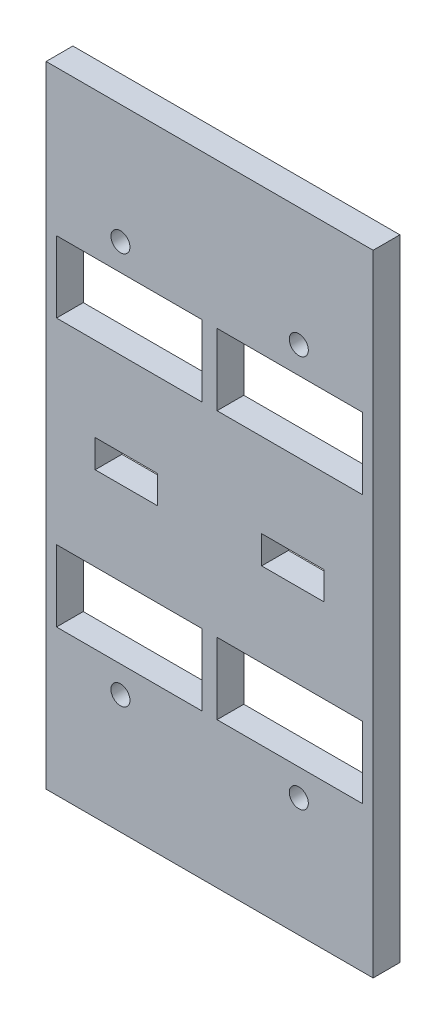
ISO-10303-21;
HEADER;
FILE_DESCRIPTION(('STEP AP214'),'2;1');
FILE_NAME('part.step','',(''),(''),'','','');
FILE_SCHEMA(('AUTOMOTIVE_DESIGN { 1 0 10303 214 1 1 1 1 }'));
ENDSEC;
DATA;
#1=APPLICATION_CONTEXT('core data for automotive mechanical design processes');
#2=APPLICATION_PROTOCOL_DEFINITION('international standard','automotive_design',2000,#1);
#3=PRODUCT_CONTEXT('',#1,'mechanical');
#4=PRODUCT('Part','Part','',(#3));
#5=PRODUCT_RELATED_PRODUCT_CATEGORY('part','',(#4));
#6=PRODUCT_DEFINITION_FORMATION('','',#4);
#7=PRODUCT_DEFINITION_CONTEXT('part definition',#1,'design');
#8=PRODUCT_DEFINITION('design','',#6,#7);
#9=PRODUCT_DEFINITION_SHAPE('','',#8);
#10=(LENGTH_UNIT() NAMED_UNIT(*) SI_UNIT(.MILLI.,.METRE.));
#11=(NAMED_UNIT(*) PLANE_ANGLE_UNIT() SI_UNIT($,.RADIAN.));
#12=(NAMED_UNIT(*) SI_UNIT($,.STERADIAN.) SOLID_ANGLE_UNIT());
#13=UNCERTAINTY_MEASURE_WITH_UNIT(LENGTH_MEASURE(1.E-05),#10,'distance_accuracy_value','');
#14=(GEOMETRIC_REPRESENTATION_CONTEXT(3) GLOBAL_UNCERTAINTY_ASSIGNED_CONTEXT((#13)) GLOBAL_UNIT_ASSIGNED_CONTEXT((#10,
#11,#12)) REPRESENTATION_CONTEXT('',''));
#15=CARTESIAN_POINT('',(0.,0.,0.));
#16=DIRECTION('',(0.,0.,1.));
#17=DIRECTION('',(1.,0.,0.));
#18=AXIS2_PLACEMENT_3D('',#15,#16,#17);
#19=CARTESIAN_POINT('',(0.,0.,4.5));
#20=DIRECTION('',(0.,0.,-1.));
#21=DIRECTION('',(-1.,0.,0.));
#22=AXIS2_PLACEMENT_3D('',#19,#20,#21);
#23=PLANE('',#22);
#24=DIRECTION('',(-1.,0.,0.));
#25=VECTOR('',#24,1.);
#26=CARTESIAN_POINT('',(19.25,2.35,4.5));
#27=LINE('',#26,#25);
#28=CARTESIAN_POINT('',(19.25,2.35,4.5));
#29=VERTEX_POINT('',#28);
#30=CARTESIAN_POINT('',(8.75000000000001,2.35,4.5));
#31=VERTEX_POINT('',#30);
#32=EDGE_CURVE('E245',#29,#31,#27,.T.);
#33=ORIENTED_EDGE('',*,*,#32,.F.);
#34=DIRECTION('',(0.,1.,0.));
#35=VECTOR('',#34,1.);
#36=CARTESIAN_POINT('',(19.25,2.35,4.5));
#37=LINE('',#36,#35);
#38=CARTESIAN_POINT('',(19.25,-2.35,4.5));
#39=VERTEX_POINT('',#38);
#40=EDGE_CURVE('E48',#39,#29,#37,.T.);
#41=ORIENTED_EDGE('',*,*,#40,.F.);
#42=DIRECTION('',(1.,0.,0.));
#43=VECTOR('',#42,1.);
#44=CARTESIAN_POINT('',(19.25,-2.35,4.5));
#45=LINE('',#44,#43);
#46=CARTESIAN_POINT('',(8.75000000000001,-2.35,4.5));
#47=VERTEX_POINT('',#46);
#48=EDGE_CURVE('E236',#47,#39,#45,.T.);
#49=ORIENTED_EDGE('',*,*,#48,.F.);
#50=DIRECTION('',(0.,-1.,0.));
#51=VECTOR('',#50,1.);
#52=CARTESIAN_POINT('',(8.75000000000001,2.35,4.5));
#53=LINE('',#52,#51);
#54=EDGE_CURVE('E239',#31,#47,#53,.T.);
#55=ORIENTED_EDGE('',*,*,#54,.F.);
#56=EDGE_LOOP('',(#33,#41,#49,#55));
#57=FACE_BOUND('',#56,.T.);
#58=DIRECTION('',(-1.,0.,0.));
#59=VECTOR('',#58,1.);
#60=CARTESIAN_POINT('',(-19.25,2.35,4.5));
#61=LINE('',#60,#59);
#62=CARTESIAN_POINT('',(-8.75,2.35,4.5));
#63=VERTEX_POINT('',#62);
#64=CARTESIAN_POINT('',(-19.25,2.35,4.5));
#65=VERTEX_POINT('',#64);
#66=EDGE_CURVE('E270',#63,#65,#61,.T.);
#67=ORIENTED_EDGE('',*,*,#66,.F.);
#68=DIRECTION('',(0.,1.,0.));
#69=VECTOR('',#68,1.);
#70=CARTESIAN_POINT('',(-8.75,2.35,4.5));
#71=LINE('',#70,#69);
#72=CARTESIAN_POINT('',(-8.75,-2.35,4.5));
#73=VERTEX_POINT('',#72);
#74=EDGE_CURVE('E251',#73,#63,#71,.T.);
#75=ORIENTED_EDGE('',*,*,#74,.F.);
#76=DIRECTION('',(1.,0.,0.));
#77=VECTOR('',#76,1.);
#78=CARTESIAN_POINT('',(-19.25,-2.35,4.5));
#79=LINE('',#78,#77);
#80=CARTESIAN_POINT('',(-19.25,-2.35,4.5));
#81=VERTEX_POINT('',#80);
#82=EDGE_CURVE('E259',#81,#73,#79,.T.);
#83=ORIENTED_EDGE('',*,*,#82,.F.);
#84=DIRECTION('',(0.,-1.,0.));
#85=VECTOR('',#84,1.);
#86=CARTESIAN_POINT('',(-19.25,2.35,4.5));
#87=LINE('',#86,#85);
#88=EDGE_CURVE('E273',#65,#81,#87,.T.);
#89=ORIENTED_EDGE('',*,*,#88,.F.);
#90=EDGE_LOOP('',(#67,#75,#83,#89));
#91=FACE_BOUND('',#90,.T.);
#92=CARTESIAN_POINT('',(-15.,-33.,4.5));
#93=DIRECTION('',(0.,0.,1.));
#94=DIRECTION('',(-1.,0.,0.));
#95=AXIS2_PLACEMENT_3D('',#92,#93,#94);
#96=CIRCLE('',#95,1.6);
#97=CARTESIAN_POINT('',(-16.6,-33.,4.5));
#98=VERTEX_POINT('',#97);
#99=EDGE_CURVE('E280',#98,#98,#96,.T.);
#100=ORIENTED_EDGE('',*,*,#99,.F.);
#101=EDGE_LOOP('',(#100));
#102=FACE_BOUND('',#101,.T.);
#103=CARTESIAN_POINT('',(15.,-33.,4.5));
#104=DIRECTION('',(0.,0.,1.));
#105=DIRECTION('',(1.,0.,0.));
#106=AXIS2_PLACEMENT_3D('',#103,#104,#105);
#107=CIRCLE('',#106,1.6);
#108=CARTESIAN_POINT('',(16.6,-33.,4.5));
#109=VERTEX_POINT('',#108);
#110=EDGE_CURVE('E290',#109,#109,#107,.T.);
#111=ORIENTED_EDGE('',*,*,#110,.F.);
#112=EDGE_LOOP('',(#111));
#113=FACE_BOUND('',#112,.T.);
#114=CARTESIAN_POINT('',(15.,33.,4.5));
#115=DIRECTION('',(0.,0.,1.));
#116=DIRECTION('',(-1.,0.,0.));
#117=AXIS2_PLACEMENT_3D('',#114,#115,#116);
#118=CIRCLE('',#117,1.6);
#119=CARTESIAN_POINT('',(13.4,33.,4.5));
#120=VERTEX_POINT('',#119);
#121=EDGE_CURVE('E296',#120,#120,#118,.T.);
#122=ORIENTED_EDGE('',*,*,#121,.F.);
#123=EDGE_LOOP('',(#122));
#124=FACE_BOUND('',#123,.T.);
#125=CARTESIAN_POINT('',(-15.,33.,4.5));
#126=DIRECTION('',(0.,0.,1.));
#127=DIRECTION('',(1.,0.,0.));
#128=AXIS2_PLACEMENT_3D('',#125,#126,#127);
#129=CIRCLE('',#128,1.6);
#130=CARTESIAN_POINT('',(-13.4,33.,4.5));
#131=VERTEX_POINT('',#130);
#132=EDGE_CURVE('E302',#131,#131,#129,.T.);
#133=ORIENTED_EDGE('',*,*,#132,.F.);
#134=EDGE_LOOP('',(#133));
#135=FACE_BOUND('',#134,.T.);
#136=DIRECTION('',(0.,1.,0.));
#137=VECTOR('',#136,1.);
#138=CARTESIAN_POINT('',(25.75,-28.5,4.5));
#139=LINE('',#138,#137);
#140=CARTESIAN_POINT('',(25.75,-28.5,4.5));
#141=VERTEX_POINT('',#140);
#142=CARTESIAN_POINT('',(25.75,-16.5,4.5));
#143=VERTEX_POINT('',#142);
#144=EDGE_CURVE('E342',#141,#143,#139,.T.);
#145=ORIENTED_EDGE('',*,*,#144,.F.);
#146=DIRECTION('',(1.,0.,0.));
#147=VECTOR('',#146,1.);
#148=CARTESIAN_POINT('',(25.75,-28.5,4.5));
#149=LINE('',#148,#147);
#150=CARTESIAN_POINT('',(1.25000000000001,-28.5,4.5));
#151=VERTEX_POINT('',#150);
#152=EDGE_CURVE('E350',#151,#141,#149,.T.);
#153=ORIENTED_EDGE('',*,*,#152,.F.);
#154=DIRECTION('',(0.,-1.,0.));
#155=VECTOR('',#154,1.);
#156=CARTESIAN_POINT('',(1.25000000000001,-28.5,4.5));
#157=LINE('',#156,#155);
#158=CARTESIAN_POINT('',(1.25000000000001,-16.5,4.5));
#159=VERTEX_POINT('',#158);
#160=EDGE_CURVE('E347',#159,#151,#157,.T.);
#161=ORIENTED_EDGE('',*,*,#160,.F.);
#162=DIRECTION('',(-1.,0.,0.));
#163=VECTOR('',#162,1.);
#164=CARTESIAN_POINT('',(25.75,-16.5,4.5));
#165=LINE('',#164,#163);
#166=EDGE_CURVE('E344',#143,#159,#165,.T.);
#167=ORIENTED_EDGE('',*,*,#166,.F.);
#168=EDGE_LOOP('',(#145,#153,#161,#167));
#169=FACE_BOUND('',#168,.T.);
#170=DIRECTION('',(0.,1.,0.));
#171=VECTOR('',#170,1.);
#172=CARTESIAN_POINT('',(-1.25000000000001,28.5,4.5));
#173=LINE('',#172,#171);
#174=CARTESIAN_POINT('',(-1.25000000000001,16.5,4.5));
#175=VERTEX_POINT('',#174);
#176=CARTESIAN_POINT('',(-1.25000000000001,28.5,4.5));
#177=VERTEX_POINT('',#176);
#178=EDGE_CURVE('E404',#175,#177,#173,.T.);
#179=ORIENTED_EDGE('',*,*,#178,.F.);
#180=DIRECTION('',(1.,0.,0.));
#181=VECTOR('',#180,1.);
#182=CARTESIAN_POINT('',(-25.75,16.5,4.5));
#183=LINE('',#182,#181);
#184=CARTESIAN_POINT('',(-25.75,16.5,4.5));
#185=VERTEX_POINT('',#184);
#186=EDGE_CURVE('E412',#185,#175,#183,.T.);
#187=ORIENTED_EDGE('',*,*,#186,.F.);
#188=DIRECTION('',(0.,-1.,0.));
#189=VECTOR('',#188,1.);
#190=CARTESIAN_POINT('',(-25.75,28.5,4.5));
#191=LINE('',#190,#189);
#192=CARTESIAN_POINT('',(-25.75,28.5,4.5));
#193=VERTEX_POINT('',#192);
#194=EDGE_CURVE('E409',#193,#185,#191,.T.);
#195=ORIENTED_EDGE('',*,*,#194,.F.);
#196=DIRECTION('',(-1.,0.,0.));
#197=VECTOR('',#196,1.);
#198=CARTESIAN_POINT('',(-25.75,28.5,4.5));
#199=LINE('',#198,#197);
#200=EDGE_CURVE('E406',#177,#193,#199,.T.);
#201=ORIENTED_EDGE('',*,*,#200,.F.);
#202=EDGE_LOOP('',(#179,#187,#195,#201));
#203=FACE_BOUND('',#202,.T.);
#204=DIRECTION('',(0.,1.,0.));
#205=VECTOR('',#204,1.);
#206=CARTESIAN_POINT('',(27.5,-53.,4.5));
#207=LINE('',#206,#205);
#208=CARTESIAN_POINT('',(27.5,-53.,4.5));
#209=VERTEX_POINT('',#208);
#210=CARTESIAN_POINT('',(27.5,53.,4.5));
#211=VERTEX_POINT('',#210);
#212=EDGE_CURVE('E435',#209,#211,#207,.T.);
#213=ORIENTED_EDGE('',*,*,#212,.T.);
#214=DIRECTION('',(-1.,0.,0.));
#215=VECTOR('',#214,1.);
#216=CARTESIAN_POINT('',(-27.5,53.,4.5));
#217=LINE('',#216,#215);
#218=CARTESIAN_POINT('',(-27.5,53.,4.5));
#219=VERTEX_POINT('',#218);
#220=EDGE_CURVE('E438',#211,#219,#217,.T.);
#221=ORIENTED_EDGE('',*,*,#220,.T.);
#222=DIRECTION('',(0.,-1.,0.));
#223=VECTOR('',#222,1.);
#224=CARTESIAN_POINT('',(-27.5,-53.,4.5));
#225=LINE('',#224,#223);
#226=CARTESIAN_POINT('',(-27.5,-53.,4.5));
#227=VERTEX_POINT('',#226);
#228=EDGE_CURVE('E441',#219,#227,#225,.T.);
#229=ORIENTED_EDGE('',*,*,#228,.T.);
#230=DIRECTION('',(1.,0.,0.));
#231=VECTOR('',#230,1.);
#232=CARTESIAN_POINT('',(-27.5,-53.,4.5));
#233=LINE('',#232,#231);
#234=EDGE_CURVE('E443',#227,#209,#233,.T.);
#235=ORIENTED_EDGE('',*,*,#234,.T.);
#236=EDGE_LOOP('',(#213,#221,#229,#235));
#237=FACE_BOUND('',#236,.T.);
#238=DIRECTION('',(0.,1.,0.));
#239=VECTOR('',#238,1.);
#240=CARTESIAN_POINT('',(25.75,28.5,4.5));
#241=LINE('',#240,#239);
#242=CARTESIAN_POINT('',(25.75,16.5,4.5));
#243=VERTEX_POINT('',#242);
#244=CARTESIAN_POINT('',(25.75,28.5,4.5));
#245=VERTEX_POINT('',#244);
#246=EDGE_CURVE('E373',#243,#245,#241,.T.);
#247=ORIENTED_EDGE('',*,*,#246,.F.);
#248=DIRECTION('',(1.,0.,0.));
#249=VECTOR('',#248,1.);
#250=CARTESIAN_POINT('',(25.75,16.5,4.5));
#251=LINE('',#250,#249);
#252=CARTESIAN_POINT('',(1.25000000000001,16.5,4.5));
#253=VERTEX_POINT('',#252);
#254=EDGE_CURVE('E381',#253,#243,#251,.T.);
#255=ORIENTED_EDGE('',*,*,#254,.F.);
#256=DIRECTION('',(0.,-1.,0.));
#257=VECTOR('',#256,1.);
#258=CARTESIAN_POINT('',(1.25000000000001,28.5,4.5));
#259=LINE('',#258,#257);
#260=CARTESIAN_POINT('',(1.25000000000001,28.5,4.5));
#261=VERTEX_POINT('',#260);
#262=EDGE_CURVE('E378',#261,#253,#259,.T.);
#263=ORIENTED_EDGE('',*,*,#262,.F.);
#264=DIRECTION('',(-1.,0.,0.));
#265=VECTOR('',#264,1.);
#266=CARTESIAN_POINT('',(25.75,28.5,4.5));
#267=LINE('',#266,#265);
#268=EDGE_CURVE('E375',#245,#261,#267,.T.);
#269=ORIENTED_EDGE('',*,*,#268,.F.);
#270=EDGE_LOOP('',(#247,#255,#263,#269));
#271=FACE_BOUND('',#270,.T.);
#272=DIRECTION('',(0.,-1.,0.));
#273=VECTOR('',#272,1.);
#274=CARTESIAN_POINT('',(-25.75,-28.5,4.5));
#275=LINE('',#274,#273);
#276=CARTESIAN_POINT('',(-25.75,-16.5,4.5));
#277=VERTEX_POINT('',#276);
#278=CARTESIAN_POINT('',(-25.75,-28.5,4.5));
#279=VERTEX_POINT('',#278);
#280=EDGE_CURVE('E311',#277,#279,#275,.T.);
#281=ORIENTED_EDGE('',*,*,#280,.F.);
#282=DIRECTION('',(-1.,0.,0.));
#283=VECTOR('',#282,1.);
#284=CARTESIAN_POINT('',(-25.75,-16.5,4.5));
#285=LINE('',#284,#283);
#286=CARTESIAN_POINT('',(-1.25000000000001,-16.5,4.5));
#287=VERTEX_POINT('',#286);
#288=EDGE_CURVE('E319',#287,#277,#285,.T.);
#289=ORIENTED_EDGE('',*,*,#288,.F.);
#290=DIRECTION('',(0.,1.,0.));
#291=VECTOR('',#290,1.);
#292=CARTESIAN_POINT('',(-1.25000000000001,-28.5,4.5));
#293=LINE('',#292,#291);
#294=CARTESIAN_POINT('',(-1.25000000000001,-28.5,4.5));
#295=VERTEX_POINT('',#294);
#296=EDGE_CURVE('E316',#295,#287,#293,.T.);
#297=ORIENTED_EDGE('',*,*,#296,.F.);
#298=DIRECTION('',(1.,0.,0.));
#299=VECTOR('',#298,1.);
#300=CARTESIAN_POINT('',(-25.75,-28.5,4.5));
#301=LINE('',#300,#299);
#302=EDGE_CURVE('E313',#279,#295,#301,.T.);
#303=ORIENTED_EDGE('',*,*,#302,.F.);
#304=EDGE_LOOP('',(#281,#289,#297,#303));
#305=FACE_BOUND('',#304,.T.);
#306=ADVANCED_FACE('F33',(#57,#91,#102,#113,#124,#135,#169,#203,#237,#271,#305),#23,.F.);
#307=CARTESIAN_POINT('',(0.,0.,0.));
#308=DIRECTION('',(0.,0.,-1.));
#309=DIRECTION('',(-1.,0.,0.));
#310=AXIS2_PLACEMENT_3D('',#307,#308,#309);
#311=PLANE('',#310);
#312=DIRECTION('',(0.,1.,0.));
#313=VECTOR('',#312,1.);
#314=CARTESIAN_POINT('',(19.25,2.35,0.));
#315=LINE('',#314,#313);
#316=CARTESIAN_POINT('',(19.25,-2.35,0.));
#317=VERTEX_POINT('',#316);
#318=CARTESIAN_POINT('',(19.25,2.35,0.));
#319=VERTEX_POINT('',#318);
#320=EDGE_CURVE('E220',#317,#319,#315,.T.);
#321=ORIENTED_EDGE('',*,*,#320,.T.);
#322=DIRECTION('',(-1.,0.,0.));
#323=VECTOR('',#322,1.);
#324=CARTESIAN_POINT('',(19.25,2.35,0.));
#325=LINE('',#324,#323);
#326=CARTESIAN_POINT('',(8.75000000000001,2.35,0.));
#327=VERTEX_POINT('',#326);
#328=EDGE_CURVE('E229',#319,#327,#325,.T.);
#329=ORIENTED_EDGE('',*,*,#328,.T.);
#330=DIRECTION('',(0.,-1.,0.));
#331=VECTOR('',#330,1.);
#332=CARTESIAN_POINT('',(8.75000000000001,2.35,0.));
#333=LINE('',#332,#331);
#334=CARTESIAN_POINT('',(8.75000000000001,-2.35,0.));
#335=VERTEX_POINT('',#334);
#336=EDGE_CURVE('E56',#327,#335,#333,.T.);
#337=ORIENTED_EDGE('',*,*,#336,.T.);
#338=DIRECTION('',(1.,0.,0.));
#339=VECTOR('',#338,1.);
#340=CARTESIAN_POINT('',(19.25,-2.35,0.));
#341=LINE('',#340,#339);
#342=EDGE_CURVE('E226',#335,#317,#341,.T.);
#343=ORIENTED_EDGE('',*,*,#342,.T.);
#344=EDGE_LOOP('',(#321,#329,#337,#343));
#345=FACE_BOUND('',#344,.T.);
#346=DIRECTION('',(0.,1.,0.));
#347=VECTOR('',#346,1.);
#348=CARTESIAN_POINT('',(-8.75,2.35,0.));
#349=LINE('',#348,#347);
#350=CARTESIAN_POINT('',(-8.75,-2.35,0.));
#351=VERTEX_POINT('',#350);
#352=CARTESIAN_POINT('',(-8.75,2.35,0.));
#353=VERTEX_POINT('',#352);
#354=EDGE_CURVE('E255',#351,#353,#349,.T.);
#355=ORIENTED_EDGE('',*,*,#354,.T.);
#356=DIRECTION('',(-1.,0.,0.));
#357=VECTOR('',#356,1.);
#358=CARTESIAN_POINT('',(-19.25,2.35,0.));
#359=LINE('',#358,#357);
#360=CARTESIAN_POINT('',(-19.25,2.35,0.));
#361=VERTEX_POINT('',#360);
#362=EDGE_CURVE('E258',#353,#361,#359,.T.);
#363=ORIENTED_EDGE('',*,*,#362,.T.);
#364=DIRECTION('',(0.,-1.,0.));
#365=VECTOR('',#364,1.);
#366=CARTESIAN_POINT('',(-19.25,2.35,0.));
#367=LINE('',#366,#365);
#368=CARTESIAN_POINT('',(-19.25,-2.35,0.));
#369=VERTEX_POINT('',#368);
#370=EDGE_CURVE('E262',#361,#369,#367,.T.);
#371=ORIENTED_EDGE('',*,*,#370,.T.);
#372=DIRECTION('',(1.,0.,0.));
#373=VECTOR('',#372,1.);
#374=CARTESIAN_POINT('',(-19.25,-2.35,0.));
#375=LINE('',#374,#373);
#376=EDGE_CURVE('E265',#369,#351,#375,.T.);
#377=ORIENTED_EDGE('',*,*,#376,.T.);
#378=EDGE_LOOP('',(#355,#363,#371,#377));
#379=FACE_BOUND('',#378,.T.);
#380=CARTESIAN_POINT('',(-15.,-33.,0.));
#381=DIRECTION('',(0.,0.,1.));
#382=DIRECTION('',(-1.,0.,0.));
#383=AXIS2_PLACEMENT_3D('',#380,#381,#382);
#384=CIRCLE('',#383,1.6);
#385=CARTESIAN_POINT('',(-16.6,-33.,0.));
#386=VERTEX_POINT('',#385);
#387=EDGE_CURVE('E287',#386,#386,#384,.T.);
#388=ORIENTED_EDGE('',*,*,#387,.T.);
#389=EDGE_LOOP('',(#388));
#390=FACE_BOUND('',#389,.T.);
#391=CARTESIAN_POINT('',(15.,-33.,0.));
#392=DIRECTION('',(0.,0.,1.));
#393=DIRECTION('',(1.,0.,0.));
#394=AXIS2_PLACEMENT_3D('',#391,#392,#393);
#395=CIRCLE('',#394,1.6);
#396=CARTESIAN_POINT('',(16.6,-33.,0.));
#397=VERTEX_POINT('',#396);
#398=EDGE_CURVE('E293',#397,#397,#395,.T.);
#399=ORIENTED_EDGE('',*,*,#398,.T.);
#400=EDGE_LOOP('',(#399));
#401=FACE_BOUND('',#400,.T.);
#402=CARTESIAN_POINT('',(15.,33.,0.));
#403=DIRECTION('',(0.,0.,1.));
#404=DIRECTION('',(-1.,0.,0.));
#405=AXIS2_PLACEMENT_3D('',#402,#403,#404);
#406=CIRCLE('',#405,1.6);
#407=CARTESIAN_POINT('',(13.4,33.,0.));
#408=VERTEX_POINT('',#407);
#409=EDGE_CURVE('E299',#408,#408,#406,.T.);
#410=ORIENTED_EDGE('',*,*,#409,.T.);
#411=EDGE_LOOP('',(#410));
#412=FACE_BOUND('',#411,.T.);
#413=CARTESIAN_POINT('',(-15.,33.,0.));
#414=DIRECTION('',(0.,0.,1.));
#415=DIRECTION('',(1.,0.,0.));
#416=AXIS2_PLACEMENT_3D('',#413,#414,#415);
#417=CIRCLE('',#416,1.6);
#418=CARTESIAN_POINT('',(-13.4,33.,0.));
#419=VERTEX_POINT('',#418);
#420=EDGE_CURVE('E305',#419,#419,#417,.T.);
#421=ORIENTED_EDGE('',*,*,#420,.T.);
#422=EDGE_LOOP('',(#421));
#423=FACE_BOUND('',#422,.T.);
#424=DIRECTION('',(0.,1.,0.));
#425=VECTOR('',#424,1.);
#426=CARTESIAN_POINT('',(27.5,-53.,0.));
#427=LINE('',#426,#425);
#428=CARTESIAN_POINT('',(27.5,-53.,0.));
#429=VERTEX_POINT('',#428);
#430=CARTESIAN_POINT('',(27.5,53.,0.));
#431=VERTEX_POINT('',#430);
#432=EDGE_CURVE('E434',#429,#431,#427,.T.);
#433=ORIENTED_EDGE('',*,*,#432,.F.);
#434=DIRECTION('',(1.,0.,0.));
#435=VECTOR('',#434,1.);
#436=CARTESIAN_POINT('',(-27.5,-53.,0.));
#437=LINE('',#436,#435);
#438=CARTESIAN_POINT('',(-27.5,-53.,0.));
#439=VERTEX_POINT('',#438);
#440=EDGE_CURVE('E439',#439,#429,#437,.T.);
#441=ORIENTED_EDGE('',*,*,#440,.F.);
#442=DIRECTION('',(0.,-1.,0.));
#443=VECTOR('',#442,1.);
#444=CARTESIAN_POINT('',(-27.5,-53.,0.));
#445=LINE('',#444,#443);
#446=CARTESIAN_POINT('',(-27.5,53.,0.));
#447=VERTEX_POINT('',#446);
#448=EDGE_CURVE('E450',#447,#439,#445,.T.);
#449=ORIENTED_EDGE('',*,*,#448,.F.);
#450=DIRECTION('',(-1.,0.,0.));
#451=VECTOR('',#450,1.);
#452=CARTESIAN_POINT('',(-27.5,53.,0.));
#453=LINE('',#452,#451);
#454=EDGE_CURVE('E448',#431,#447,#453,.T.);
#455=ORIENTED_EDGE('',*,*,#454,.F.);
#456=EDGE_LOOP('',(#433,#441,#449,#455));
#457=FACE_BOUND('',#456,.T.);
#458=DIRECTION('',(1.,0.,0.));
#459=VECTOR('',#458,1.);
#460=CARTESIAN_POINT('',(-25.75,16.5,0.));
#461=LINE('',#460,#459);
#462=CARTESIAN_POINT('',(-25.75,16.5,0.));
#463=VERTEX_POINT('',#462);
#464=CARTESIAN_POINT('',(-1.25000000000001,16.5,0.));
#465=VERTEX_POINT('',#464);
#466=EDGE_CURVE('E407',#463,#465,#461,.T.);
#467=ORIENTED_EDGE('',*,*,#466,.T.);
#468=DIRECTION('',(0.,1.,0.));
#469=VECTOR('',#468,1.);
#470=CARTESIAN_POINT('',(-1.25000000000001,28.5,0.));
#471=LINE('',#470,#469);
#472=CARTESIAN_POINT('',(-1.25000000000001,28.5,0.));
#473=VERTEX_POINT('',#472);
#474=EDGE_CURVE('E403',#465,#473,#471,.T.);
#475=ORIENTED_EDGE('',*,*,#474,.T.);
#476=DIRECTION('',(-1.,0.,0.));
#477=VECTOR('',#476,1.);
#478=CARTESIAN_POINT('',(-25.75,28.5,0.));
#479=LINE('',#478,#477);
#480=CARTESIAN_POINT('',(-25.75,28.5,0.));
#481=VERTEX_POINT('',#480);
#482=EDGE_CURVE('E417',#473,#481,#479,.T.);
#483=ORIENTED_EDGE('',*,*,#482,.T.);
#484=DIRECTION('',(0.,-1.,0.));
#485=VECTOR('',#484,1.);
#486=CARTESIAN_POINT('',(-25.75,28.5,0.));
#487=LINE('',#486,#485);
#488=EDGE_CURVE('E420',#481,#463,#487,.T.);
#489=ORIENTED_EDGE('',*,*,#488,.T.);
#490=EDGE_LOOP('',(#467,#475,#483,#489));
#491=FACE_BOUND('',#490,.T.);
#492=DIRECTION('',(1.,0.,0.));
#493=VECTOR('',#492,1.);
#494=CARTESIAN_POINT('',(25.75,16.5,0.));
#495=LINE('',#494,#493);
#496=CARTESIAN_POINT('',(1.25000000000001,16.5,0.));
#497=VERTEX_POINT('',#496);
#498=CARTESIAN_POINT('',(25.75,16.5,0.));
#499=VERTEX_POINT('',#498);
#500=EDGE_CURVE('E376',#497,#499,#495,.T.);
#501=ORIENTED_EDGE('',*,*,#500,.T.);
#502=DIRECTION('',(0.,1.,0.));
#503=VECTOR('',#502,1.);
#504=CARTESIAN_POINT('',(25.75,28.5,0.));
#505=LINE('',#504,#503);
#506=CARTESIAN_POINT('',(25.75,28.5,0.));
#507=VERTEX_POINT('',#506);
#508=EDGE_CURVE('E372',#499,#507,#505,.T.);
#509=ORIENTED_EDGE('',*,*,#508,.T.);
#510=DIRECTION('',(-1.,0.,0.));
#511=VECTOR('',#510,1.);
#512=CARTESIAN_POINT('',(25.75,28.5,0.));
#513=LINE('',#512,#511);
#514=CARTESIAN_POINT('',(1.25000000000001,28.5,0.));
#515=VERTEX_POINT('',#514);
#516=EDGE_CURVE('E386',#507,#515,#513,.T.);
#517=ORIENTED_EDGE('',*,*,#516,.T.);
#518=DIRECTION('',(0.,-1.,0.));
#519=VECTOR('',#518,1.);
#520=CARTESIAN_POINT('',(1.25000000000001,28.5,0.));
#521=LINE('',#520,#519);
#522=EDGE_CURVE('E389',#515,#497,#521,.T.);
#523=ORIENTED_EDGE('',*,*,#522,.T.);
#524=EDGE_LOOP('',(#501,#509,#517,#523));
#525=FACE_BOUND('',#524,.T.);
#526=DIRECTION('',(1.,0.,0.));
#527=VECTOR('',#526,1.);
#528=CARTESIAN_POINT('',(25.75,-28.5,0.));
#529=LINE('',#528,#527);
#530=CARTESIAN_POINT('',(1.25000000000001,-28.5,0.));
#531=VERTEX_POINT('',#530);
#532=CARTESIAN_POINT('',(25.75,-28.5,0.));
#533=VERTEX_POINT('',#532);
#534=EDGE_CURVE('E345',#531,#533,#529,.T.);
#535=ORIENTED_EDGE('',*,*,#534,.T.);
#536=DIRECTION('',(0.,1.,0.));
#537=VECTOR('',#536,1.);
#538=CARTESIAN_POINT('',(25.75,-28.5,0.));
#539=LINE('',#538,#537);
#540=CARTESIAN_POINT('',(25.75,-16.5,0.));
#541=VERTEX_POINT('',#540);
#542=EDGE_CURVE('E341',#533,#541,#539,.T.);
#543=ORIENTED_EDGE('',*,*,#542,.T.);
#544=DIRECTION('',(-1.,0.,0.));
#545=VECTOR('',#544,1.);
#546=CARTESIAN_POINT('',(25.75,-16.5,0.));
#547=LINE('',#546,#545);
#548=CARTESIAN_POINT('',(1.25000000000001,-16.5,0.));
#549=VERTEX_POINT('',#548);
#550=EDGE_CURVE('E355',#541,#549,#547,.T.);
#551=ORIENTED_EDGE('',*,*,#550,.T.);
#552=DIRECTION('',(0.,-1.,0.));
#553=VECTOR('',#552,1.);
#554=CARTESIAN_POINT('',(1.25000000000001,-28.5,0.));
#555=LINE('',#554,#553);
#556=EDGE_CURVE('E358',#549,#531,#555,.T.);
#557=ORIENTED_EDGE('',*,*,#556,.T.);
#558=EDGE_LOOP('',(#535,#543,#551,#557));
#559=FACE_BOUND('',#558,.T.);
#560=DIRECTION('',(-1.,0.,0.));
#561=VECTOR('',#560,1.);
#562=CARTESIAN_POINT('',(-25.75,-16.5,0.));
#563=LINE('',#562,#561);
#564=CARTESIAN_POINT('',(-1.25000000000001,-16.5,0.));
#565=VERTEX_POINT('',#564);
#566=CARTESIAN_POINT('',(-25.75,-16.5,0.));
#567=VERTEX_POINT('',#566);
#568=EDGE_CURVE('E314',#565,#567,#563,.T.);
#569=ORIENTED_EDGE('',*,*,#568,.T.);
#570=DIRECTION('',(0.,-1.,0.));
#571=VECTOR('',#570,1.);
#572=CARTESIAN_POINT('',(-25.75,-28.5,0.));
#573=LINE('',#572,#571);
#574=CARTESIAN_POINT('',(-25.75,-28.5,0.));
#575=VERTEX_POINT('',#574);
#576=EDGE_CURVE('E308',#567,#575,#573,.T.);
#577=ORIENTED_EDGE('',*,*,#576,.T.);
#578=DIRECTION('',(1.,0.,0.));
#579=VECTOR('',#578,1.);
#580=CARTESIAN_POINT('',(-25.75,-28.5,0.));
#581=LINE('',#580,#579);
#582=CARTESIAN_POINT('',(-1.25000000000001,-28.5,0.));
#583=VERTEX_POINT('',#582);
#584=EDGE_CURVE('E324',#575,#583,#581,.T.);
#585=ORIENTED_EDGE('',*,*,#584,.T.);
#586=DIRECTION('',(0.,1.,0.));
#587=VECTOR('',#586,1.);
#588=CARTESIAN_POINT('',(-1.25000000000001,-28.5,0.));
#589=LINE('',#588,#587);
#590=EDGE_CURVE('E327',#583,#565,#589,.T.);
#591=ORIENTED_EDGE('',*,*,#590,.T.);
#592=EDGE_LOOP('',(#569,#577,#585,#591));
#593=FACE_BOUND('',#592,.T.);
#594=ADVANCED_FACE('F233',(#345,#379,#390,#401,#412,#423,#457,#491,#525,#559,#593),#311,.T.);
#595=CARTESIAN_POINT('',(27.5,-53.,4.5));
#596=DIRECTION('',(-1.,0.,0.));
#597=DIRECTION('',(0.,0.,1.));
#598=AXIS2_PLACEMENT_3D('',#595,#596,#597);
#599=PLANE('',#598);
#600=ORIENTED_EDGE('',*,*,#432,.T.);
#601=DIRECTION('',(0.,0.,-1.));
#602=VECTOR('',#601,1.);
#603=CARTESIAN_POINT('',(27.5,53.,4.5));
#604=LINE('',#603,#602);
#605=EDGE_CURVE('E11',#211,#431,#604,.T.);
#606=ORIENTED_EDGE('',*,*,#605,.F.);
#607=ORIENTED_EDGE('',*,*,#212,.F.);
#608=DIRECTION('',(0.,0.,-1.));
#609=VECTOR('',#608,1.);
#610=CARTESIAN_POINT('',(27.5,-53.,4.5));
#611=LINE('',#610,#609);
#612=EDGE_CURVE('E445',#209,#429,#611,.T.);
#613=ORIENTED_EDGE('',*,*,#612,.T.);
#614=EDGE_LOOP('',(#600,#606,#607,#613));
#615=FACE_BOUND('',#614,.T.);
#616=ADVANCED_FACE('F35',(#615),#599,.F.);
#617=CARTESIAN_POINT('',(-27.5,53.,4.5));
#618=DIRECTION('',(0.,-1.,0.));
#619=DIRECTION('',(0.,0.,-1.));
#620=AXIS2_PLACEMENT_3D('',#617,#618,#619);
#621=PLANE('',#620);
#622=ORIENTED_EDGE('',*,*,#454,.T.);
#623=DIRECTION('',(0.,0.,-1.));
#624=VECTOR('',#623,1.);
#625=CARTESIAN_POINT('',(-27.5,53.,4.5));
#626=LINE('',#625,#624);
#627=EDGE_CURVE('E41',#219,#447,#626,.T.);
#628=ORIENTED_EDGE('',*,*,#627,.F.);
#629=ORIENTED_EDGE('',*,*,#220,.F.);
#630=ORIENTED_EDGE('',*,*,#605,.T.);
#631=EDGE_LOOP('',(#622,#628,#629,#630));
#632=FACE_BOUND('',#631,.T.);
#633=ADVANCED_FACE('F478',(#632),#621,.F.);
#634=CARTESIAN_POINT('',(-27.5,-53.,4.5));
#635=DIRECTION('',(1.,0.,0.));
#636=DIRECTION('',(0.,0.,-1.));
#637=AXIS2_PLACEMENT_3D('',#634,#635,#636);
#638=PLANE('',#637);
#639=ORIENTED_EDGE('',*,*,#448,.T.);
#640=DIRECTION('',(0.,0.,-1.));
#641=VECTOR('',#640,1.);
#642=CARTESIAN_POINT('',(-27.5,-53.,4.5));
#643=LINE('',#642,#641);
#644=EDGE_CURVE('E455',#227,#439,#643,.T.);
#645=ORIENTED_EDGE('',*,*,#644,.F.);
#646=ORIENTED_EDGE('',*,*,#228,.F.);
#647=ORIENTED_EDGE('',*,*,#627,.T.);
#648=EDGE_LOOP('',(#639,#645,#646,#647));
#649=FACE_BOUND('',#648,.T.);
#650=ADVANCED_FACE('F462',(#649),#638,.F.);
#651=CARTESIAN_POINT('',(-27.5,-53.,4.5));
#652=DIRECTION('',(0.,1.,0.));
#653=DIRECTION('',(0.,0.,1.));
#654=AXIS2_PLACEMENT_3D('',#651,#652,#653);
#655=PLANE('',#654);
#656=ORIENTED_EDGE('',*,*,#440,.T.);
#657=ORIENTED_EDGE('',*,*,#612,.F.);
#658=ORIENTED_EDGE('',*,*,#234,.F.);
#659=ORIENTED_EDGE('',*,*,#644,.T.);
#660=EDGE_LOOP('',(#656,#657,#658,#659));
#661=FACE_BOUND('',#660,.T.);
#662=ADVANCED_FACE('F471',(#661),#655,.F.);
#663=CARTESIAN_POINT('',(-1.25000000000001,28.5,4.5));
#664=DIRECTION('',(-1.,0.,0.));
#665=DIRECTION('',(0.,-1.,0.));
#666=AXIS2_PLACEMENT_3D('',#663,#664,#665);
#667=PLANE('',#666);
#668=ORIENTED_EDGE('',*,*,#474,.F.);
#669=DIRECTION('',(0.,0.,-1.));
#670=VECTOR('',#669,1.);
#671=CARTESIAN_POINT('',(-1.25000000000001,16.5,4.5));
#672=LINE('',#671,#670);
#673=EDGE_CURVE('E414',#175,#465,#672,.T.);
#674=ORIENTED_EDGE('',*,*,#673,.F.);
#675=ORIENTED_EDGE('',*,*,#178,.T.);
#676=DIRECTION('',(0.,0.,-1.));
#677=VECTOR('',#676,1.);
#678=CARTESIAN_POINT('',(-1.25000000000001,28.5,4.5));
#679=LINE('',#678,#677);
#680=EDGE_CURVE('E431',#177,#473,#679,.T.);
#681=ORIENTED_EDGE('',*,*,#680,.T.);
#682=EDGE_LOOP('',(#668,#674,#675,#681));
#683=FACE_BOUND('',#682,.T.);
#684=ADVANCED_FACE('F494',(#683),#667,.T.);
#685=CARTESIAN_POINT('',(-25.75,28.5,4.5));
#686=DIRECTION('',(0.,-1.,0.));
#687=DIRECTION('',(0.,0.,-1.));
#688=AXIS2_PLACEMENT_3D('',#685,#686,#687);
#689=PLANE('',#688);
#690=ORIENTED_EDGE('',*,*,#482,.F.);
#691=ORIENTED_EDGE('',*,*,#680,.F.);
#692=ORIENTED_EDGE('',*,*,#200,.T.);
#693=DIRECTION('',(0.,0.,-1.));
#694=VECTOR('',#693,1.);
#695=CARTESIAN_POINT('',(-25.75,28.5,4.5));
#696=LINE('',#695,#694);
#697=EDGE_CURVE('E429',#193,#481,#696,.T.);
#698=ORIENTED_EDGE('',*,*,#697,.T.);
#699=EDGE_LOOP('',(#690,#691,#692,#698));
#700=FACE_BOUND('',#699,.T.);
#701=ADVANCED_FACE('F501',(#700),#689,.T.);
#702=CARTESIAN_POINT('',(-25.75,28.5,4.5));
#703=DIRECTION('',(1.,0.,0.));
#704=DIRECTION('',(0.,0.,-1.));
#705=AXIS2_PLACEMENT_3D('',#702,#703,#704);
#706=PLANE('',#705);
#707=ORIENTED_EDGE('',*,*,#488,.F.);
#708=ORIENTED_EDGE('',*,*,#697,.F.);
#709=ORIENTED_EDGE('',*,*,#194,.T.);
#710=DIRECTION('',(0.,0.,-1.));
#711=VECTOR('',#710,1.);
#712=CARTESIAN_POINT('',(-25.75,16.5,4.5));
#713=LINE('',#712,#711);
#714=EDGE_CURVE('E427',#185,#463,#713,.T.);
#715=ORIENTED_EDGE('',*,*,#714,.T.);
#716=EDGE_LOOP('',(#707,#708,#709,#715));
#717=FACE_BOUND('',#716,.T.);
#718=ADVANCED_FACE('F506',(#717),#706,.T.);
#719=CARTESIAN_POINT('',(-25.75,16.5,4.5));
#720=DIRECTION('',(0.,1.,0.));
#721=DIRECTION('',(0.,0.,1.));
#722=AXIS2_PLACEMENT_3D('',#719,#720,#721);
#723=PLANE('',#722);
#724=ORIENTED_EDGE('',*,*,#466,.F.);
#725=ORIENTED_EDGE('',*,*,#714,.F.);
#726=ORIENTED_EDGE('',*,*,#186,.T.);
#727=ORIENTED_EDGE('',*,*,#673,.T.);
#728=EDGE_LOOP('',(#724,#725,#726,#727));
#729=FACE_BOUND('',#728,.T.);
#730=ADVANCED_FACE('F513',(#729),#723,.T.);
#731=CARTESIAN_POINT('',(25.75,28.5,4.5));
#732=DIRECTION('',(-1.,0.,0.));
#733=DIRECTION('',(0.,0.,1.));
#734=AXIS2_PLACEMENT_3D('',#731,#732,#733);
#735=PLANE('',#734);
#736=ORIENTED_EDGE('',*,*,#508,.F.);
#737=DIRECTION('',(0.,0.,-1.));
#738=VECTOR('',#737,1.);
#739=CARTESIAN_POINT('',(25.75,16.5,4.5));
#740=LINE('',#739,#738);
#741=EDGE_CURVE('E383',#243,#499,#740,.T.);
#742=ORIENTED_EDGE('',*,*,#741,.F.);
#743=ORIENTED_EDGE('',*,*,#246,.T.);
#744=DIRECTION('',(0.,0.,-1.));
#745=VECTOR('',#744,1.);
#746=CARTESIAN_POINT('',(25.75,28.5,4.5));
#747=LINE('',#746,#745);
#748=EDGE_CURVE('E400',#245,#507,#747,.T.);
#749=ORIENTED_EDGE('',*,*,#748,.T.);
#750=EDGE_LOOP('',(#736,#742,#743,#749));
#751=FACE_BOUND('',#750,.T.);
#752=ADVANCED_FACE('F527',(#751),#735,.T.);
#753=CARTESIAN_POINT('',(25.75,28.5,4.5));
#754=DIRECTION('',(0.,-1.,0.));
#755=DIRECTION('',(0.,0.,-1.));
#756=AXIS2_PLACEMENT_3D('',#753,#754,#755);
#757=PLANE('',#756);
#758=ORIENTED_EDGE('',*,*,#516,.F.);
#759=ORIENTED_EDGE('',*,*,#748,.F.);
#760=ORIENTED_EDGE('',*,*,#268,.T.);
#761=DIRECTION('',(0.,0.,-1.));
#762=VECTOR('',#761,1.);
#763=CARTESIAN_POINT('',(1.25000000000001,28.5,4.5));
#764=LINE('',#763,#762);
#765=EDGE_CURVE('E398',#261,#515,#764,.T.);
#766=ORIENTED_EDGE('',*,*,#765,.T.);
#767=EDGE_LOOP('',(#758,#759,#760,#766));
#768=FACE_BOUND('',#767,.T.);
#769=ADVANCED_FACE('F532',(#768),#757,.T.);
#770=CARTESIAN_POINT('',(1.25000000000001,28.5,4.5));
#771=DIRECTION('',(1.,0.,0.));
#772=DIRECTION('',(0.,1.,0.));
#773=AXIS2_PLACEMENT_3D('',#770,#771,#772);
#774=PLANE('',#773);
#775=ORIENTED_EDGE('',*,*,#522,.F.);
#776=ORIENTED_EDGE('',*,*,#765,.F.);
#777=ORIENTED_EDGE('',*,*,#262,.T.);
#778=DIRECTION('',(0.,0.,-1.));
#779=VECTOR('',#778,1.);
#780=CARTESIAN_POINT('',(1.25000000000001,16.5,4.5));
#781=LINE('',#780,#779);
#782=EDGE_CURVE('E396',#253,#497,#781,.T.);
#783=ORIENTED_EDGE('',*,*,#782,.T.);
#784=EDGE_LOOP('',(#775,#776,#777,#783));
#785=FACE_BOUND('',#784,.T.);
#786=ADVANCED_FACE('F536',(#785),#774,.T.);
#787=CARTESIAN_POINT('',(25.75,16.5,4.5));
#788=DIRECTION('',(0.,1.,0.));
#789=DIRECTION('',(0.,0.,1.));
#790=AXIS2_PLACEMENT_3D('',#787,#788,#789);
#791=PLANE('',#790);
#792=ORIENTED_EDGE('',*,*,#500,.F.);
#793=ORIENTED_EDGE('',*,*,#782,.F.);
#794=ORIENTED_EDGE('',*,*,#254,.T.);
#795=ORIENTED_EDGE('',*,*,#741,.T.);
#796=EDGE_LOOP('',(#792,#793,#794,#795));
#797=FACE_BOUND('',#796,.T.);
#798=ADVANCED_FACE('F540',(#797),#791,.T.);
#799=CARTESIAN_POINT('',(25.75,-28.5,4.5));
#800=DIRECTION('',(-1.,0.,0.));
#801=DIRECTION('',(0.,0.,1.));
#802=AXIS2_PLACEMENT_3D('',#799,#800,#801);
#803=PLANE('',#802);
#804=ORIENTED_EDGE('',*,*,#542,.F.);
#805=DIRECTION('',(0.,0.,-1.));
#806=VECTOR('',#805,1.);
#807=CARTESIAN_POINT('',(25.75,-28.5,4.5));
#808=LINE('',#807,#806);
#809=EDGE_CURVE('E352',#141,#533,#808,.T.);
#810=ORIENTED_EDGE('',*,*,#809,.F.);
#811=ORIENTED_EDGE('',*,*,#144,.T.);
#812=DIRECTION('',(0.,0.,-1.));
#813=VECTOR('',#812,1.);
#814=CARTESIAN_POINT('',(25.75,-16.5,4.5));
#815=LINE('',#814,#813);
#816=EDGE_CURVE('E369',#143,#541,#815,.T.);
#817=ORIENTED_EDGE('',*,*,#816,.T.);
#818=EDGE_LOOP('',(#804,#810,#811,#817));
#819=FACE_BOUND('',#818,.T.);
#820=ADVANCED_FACE('F544',(#819),#803,.T.);
#821=CARTESIAN_POINT('',(25.75,-16.5,4.5));
#822=DIRECTION('',(0.,-1.,0.));
#823=DIRECTION('',(0.,0.,-1.));
#824=AXIS2_PLACEMENT_3D('',#821,#822,#823);
#825=PLANE('',#824);
#826=ORIENTED_EDGE('',*,*,#550,.F.);
#827=ORIENTED_EDGE('',*,*,#816,.F.);
#828=ORIENTED_EDGE('',*,*,#166,.T.);
#829=DIRECTION('',(0.,0.,-1.));
#830=VECTOR('',#829,1.);
#831=CARTESIAN_POINT('',(1.25000000000001,-16.5,4.5));
#832=LINE('',#831,#830);
#833=EDGE_CURVE('E367',#159,#549,#832,.T.);
#834=ORIENTED_EDGE('',*,*,#833,.T.);
#835=EDGE_LOOP('',(#826,#827,#828,#834));
#836=FACE_BOUND('',#835,.T.);
#837=ADVANCED_FACE('F548',(#836),#825,.T.);
#838=CARTESIAN_POINT('',(1.25000000000001,-28.5,4.5));
#839=DIRECTION('',(1.,0.,0.));
#840=DIRECTION('',(0.,1.,0.));
#841=AXIS2_PLACEMENT_3D('',#838,#839,#840);
#842=PLANE('',#841);
#843=ORIENTED_EDGE('',*,*,#556,.F.);
#844=ORIENTED_EDGE('',*,*,#833,.F.);
#845=ORIENTED_EDGE('',*,*,#160,.T.);
#846=DIRECTION('',(0.,0.,-1.));
#847=VECTOR('',#846,1.);
#848=CARTESIAN_POINT('',(1.25000000000001,-28.5,4.5));
#849=LINE('',#848,#847);
#850=EDGE_CURVE('E365',#151,#531,#849,.T.);
#851=ORIENTED_EDGE('',*,*,#850,.T.);
#852=EDGE_LOOP('',(#843,#844,#845,#851));
#853=FACE_BOUND('',#852,.T.);
#854=ADVANCED_FACE('F552',(#853),#842,.T.);
#855=CARTESIAN_POINT('',(25.75,-28.5,4.5));
#856=DIRECTION('',(0.,1.,0.));
#857=DIRECTION('',(0.,0.,1.));
#858=AXIS2_PLACEMENT_3D('',#855,#856,#857);
#859=PLANE('',#858);
#860=ORIENTED_EDGE('',*,*,#534,.F.);
#861=ORIENTED_EDGE('',*,*,#850,.F.);
#862=ORIENTED_EDGE('',*,*,#152,.T.);
#863=ORIENTED_EDGE('',*,*,#809,.T.);
#864=EDGE_LOOP('',(#860,#861,#862,#863));
#865=FACE_BOUND('',#864,.T.);
#866=ADVANCED_FACE('F556',(#865),#859,.T.);
#867=CARTESIAN_POINT('',(-25.75,-28.5,4.5));
#868=DIRECTION('',(1.,0.,0.));
#869=DIRECTION('',(0.,0.,-1.));
#870=AXIS2_PLACEMENT_3D('',#867,#868,#869);
#871=PLANE('',#870);
#872=ORIENTED_EDGE('',*,*,#576,.F.);
#873=DIRECTION('',(0.,0.,-1.));
#874=VECTOR('',#873,1.);
#875=CARTESIAN_POINT('',(-25.75,-16.5,4.5));
#876=LINE('',#875,#874);
#877=EDGE_CURVE('E321',#277,#567,#876,.T.);
#878=ORIENTED_EDGE('',*,*,#877,.F.);
#879=ORIENTED_EDGE('',*,*,#280,.T.);
#880=DIRECTION('',(0.,0.,-1.));
#881=VECTOR('',#880,1.);
#882=CARTESIAN_POINT('',(-25.75,-28.5,4.5));
#883=LINE('',#882,#881);
#884=EDGE_CURVE('E338',#279,#575,#883,.T.);
#885=ORIENTED_EDGE('',*,*,#884,.T.);
#886=EDGE_LOOP('',(#872,#878,#879,#885));
#887=FACE_BOUND('',#886,.T.);
#888=ADVANCED_FACE('F560',(#887),#871,.T.);
#889=CARTESIAN_POINT('',(-25.75,-28.5,4.5));
#890=DIRECTION('',(0.,1.,0.));
#891=DIRECTION('',(0.,0.,1.));
#892=AXIS2_PLACEMENT_3D('',#889,#890,#891);
#893=PLANE('',#892);
#894=ORIENTED_EDGE('',*,*,#584,.F.);
#895=ORIENTED_EDGE('',*,*,#884,.F.);
#896=ORIENTED_EDGE('',*,*,#302,.T.);
#897=DIRECTION('',(0.,0.,-1.));
#898=VECTOR('',#897,1.);
#899=CARTESIAN_POINT('',(-1.25000000000001,-28.5,4.5));
#900=LINE('',#899,#898);
#901=EDGE_CURVE('E336',#295,#583,#900,.T.);
#902=ORIENTED_EDGE('',*,*,#901,.T.);
#903=EDGE_LOOP('',(#894,#895,#896,#902));
#904=FACE_BOUND('',#903,.T.);
#905=ADVANCED_FACE('F564',(#904),#893,.T.);
#906=CARTESIAN_POINT('',(-1.25000000000001,-28.5,4.5));
#907=DIRECTION('',(-1.,0.,0.));
#908=DIRECTION('',(0.,-1.,0.));
#909=AXIS2_PLACEMENT_3D('',#906,#907,#908);
#910=PLANE('',#909);
#911=ORIENTED_EDGE('',*,*,#590,.F.);
#912=ORIENTED_EDGE('',*,*,#901,.F.);
#913=ORIENTED_EDGE('',*,*,#296,.T.);
#914=DIRECTION('',(0.,0.,-1.));
#915=VECTOR('',#914,1.);
#916=CARTESIAN_POINT('',(-1.25000000000001,-16.5,4.5));
#917=LINE('',#916,#915);
#918=EDGE_CURVE('E334',#287,#565,#917,.T.);
#919=ORIENTED_EDGE('',*,*,#918,.T.);
#920=EDGE_LOOP('',(#911,#912,#913,#919));
#921=FACE_BOUND('',#920,.T.);
#922=ADVANCED_FACE('F568',(#921),#910,.T.);
#923=CARTESIAN_POINT('',(-25.75,-16.5,4.5));
#924=DIRECTION('',(0.,-1.,0.));
#925=DIRECTION('',(0.,0.,-1.));
#926=AXIS2_PLACEMENT_3D('',#923,#924,#925);
#927=PLANE('',#926);
#928=ORIENTED_EDGE('',*,*,#568,.F.);
#929=ORIENTED_EDGE('',*,*,#918,.F.);
#930=ORIENTED_EDGE('',*,*,#288,.T.);
#931=ORIENTED_EDGE('',*,*,#877,.T.);
#932=EDGE_LOOP('',(#928,#929,#930,#931));
#933=FACE_BOUND('',#932,.T.);
#934=ADVANCED_FACE('F572',(#933),#927,.T.);
#935=CARTESIAN_POINT('',(-15.,33.,0.));
#936=DIRECTION('',(0.,0.,1.));
#937=DIRECTION('',(1.,0.,0.));
#938=AXIS2_PLACEMENT_3D('',#935,#936,#937);
#939=CYLINDRICAL_SURFACE('',#938,1.6);
#940=ORIENTED_EDGE('',*,*,#420,.F.);
#941=EDGE_LOOP('',(#940));
#942=FACE_BOUND('',#941,.T.);
#943=ORIENTED_EDGE('',*,*,#132,.T.);
#944=EDGE_LOOP('',(#943));
#945=FACE_BOUND('',#944,.T.);
#946=ADVANCED_FACE('F576',(#942,#945),#939,.F.);
#947=CARTESIAN_POINT('',(15.,33.,0.));
#948=DIRECTION('',(0.,0.,1.));
#949=DIRECTION('',(1.,0.,0.));
#950=AXIS2_PLACEMENT_3D('',#947,#948,#949);
#951=CYLINDRICAL_SURFACE('',#950,1.6);
#952=ORIENTED_EDGE('',*,*,#409,.F.);
#953=EDGE_LOOP('',(#952));
#954=FACE_BOUND('',#953,.T.);
#955=ORIENTED_EDGE('',*,*,#121,.T.);
#956=EDGE_LOOP('',(#955));
#957=FACE_BOUND('',#956,.T.);
#958=ADVANCED_FACE('F580',(#954,#957),#951,.F.);
#959=CARTESIAN_POINT('',(15.,-33.,0.));
#960=DIRECTION('',(0.,0.,1.));
#961=DIRECTION('',(1.,0.,0.));
#962=AXIS2_PLACEMENT_3D('',#959,#960,#961);
#963=CYLINDRICAL_SURFACE('',#962,1.6);
#964=ORIENTED_EDGE('',*,*,#398,.F.);
#965=EDGE_LOOP('',(#964));
#966=FACE_BOUND('',#965,.T.);
#967=ORIENTED_EDGE('',*,*,#110,.T.);
#968=EDGE_LOOP('',(#967));
#969=FACE_BOUND('',#968,.T.);
#970=ADVANCED_FACE('F584',(#966,#969),#963,.F.);
#971=CARTESIAN_POINT('',(-15.,-33.,0.));
#972=DIRECTION('',(0.,0.,1.));
#973=DIRECTION('',(1.,0.,0.));
#974=AXIS2_PLACEMENT_3D('',#971,#972,#973);
#975=CYLINDRICAL_SURFACE('',#974,1.6);
#976=ORIENTED_EDGE('',*,*,#387,.F.);
#977=EDGE_LOOP('',(#976));
#978=FACE_BOUND('',#977,.T.);
#979=ORIENTED_EDGE('',*,*,#99,.T.);
#980=EDGE_LOOP('',(#979));
#981=FACE_BOUND('',#980,.T.);
#982=ADVANCED_FACE('F588',(#978,#981),#975,.F.);
#983=CARTESIAN_POINT('',(-8.75,2.35,0.));
#984=DIRECTION('',(1.,0.,0.));
#985=DIRECTION('',(0.,0.,-1.));
#986=AXIS2_PLACEMENT_3D('',#983,#984,#985);
#987=PLANE('',#986);
#988=ORIENTED_EDGE('',*,*,#74,.T.);
#989=DIRECTION('',(0.,0.,1.));
#990=VECTOR('',#989,1.);
#991=CARTESIAN_POINT('',(-8.75,2.35,0.));
#992=LINE('',#991,#990);
#993=EDGE_CURVE('E268',#353,#63,#992,.T.);
#994=ORIENTED_EDGE('',*,*,#993,.F.);
#995=ORIENTED_EDGE('',*,*,#354,.F.);
#996=DIRECTION('',(0.,0.,1.));
#997=VECTOR('',#996,1.);
#998=CARTESIAN_POINT('',(-8.75,-2.35,0.));
#999=LINE('',#998,#997);
#1000=EDGE_CURVE('E278',#351,#73,#999,.T.);
#1001=ORIENTED_EDGE('',*,*,#1000,.T.);
#1002=EDGE_LOOP('',(#988,#994,#995,#1001));
#1003=FACE_BOUND('',#1002,.T.);
#1004=ADVANCED_FACE('F592',(#1003),#987,.F.);
#1005=CARTESIAN_POINT('',(-19.25,-2.35,0.));
#1006=DIRECTION('',(0.,-1.,0.));
#1007=DIRECTION('',(0.,0.,-1.));
#1008=AXIS2_PLACEMENT_3D('',#1005,#1006,#1007);
#1009=PLANE('',#1008);
#1010=ORIENTED_EDGE('',*,*,#82,.T.);
#1011=ORIENTED_EDGE('',*,*,#1000,.F.);
#1012=ORIENTED_EDGE('',*,*,#376,.F.);
#1013=DIRECTION('',(0.,0.,1.));
#1014=VECTOR('',#1013,1.);
#1015=CARTESIAN_POINT('',(-19.25,-2.35,0.));
#1016=LINE('',#1015,#1014);
#1017=EDGE_CURVE('E281',#369,#81,#1016,.T.);
#1018=ORIENTED_EDGE('',*,*,#1017,.T.);
#1019=EDGE_LOOP('',(#1010,#1011,#1012,#1018));
#1020=FACE_BOUND('',#1019,.T.);
#1021=ADVANCED_FACE('F596',(#1020),#1009,.F.);
#1022=CARTESIAN_POINT('',(-19.25,2.35,0.));
#1023=DIRECTION('',(-1.,0.,0.));
#1024=DIRECTION('',(0.,0.,1.));
#1025=AXIS2_PLACEMENT_3D('',#1022,#1023,#1024);
#1026=PLANE('',#1025);
#1027=ORIENTED_EDGE('',*,*,#88,.T.);
#1028=ORIENTED_EDGE('',*,*,#1017,.F.);
#1029=ORIENTED_EDGE('',*,*,#370,.F.);
#1030=DIRECTION('',(0.,0.,1.));
#1031=VECTOR('',#1030,1.);
#1032=CARTESIAN_POINT('',(-19.25,2.35,0.));
#1033=LINE('',#1032,#1031);
#1034=EDGE_CURVE('E283',#361,#65,#1033,.T.);
#1035=ORIENTED_EDGE('',*,*,#1034,.T.);
#1036=EDGE_LOOP('',(#1027,#1028,#1029,#1035));
#1037=FACE_BOUND('',#1036,.T.);
#1038=ADVANCED_FACE('F601',(#1037),#1026,.F.);
#1039=CARTESIAN_POINT('',(-19.25,2.35,0.));
#1040=DIRECTION('',(0.,1.,0.));
#1041=DIRECTION('',(0.,0.,1.));
#1042=AXIS2_PLACEMENT_3D('',#1039,#1040,#1041);
#1043=PLANE('',#1042);
#1044=ORIENTED_EDGE('',*,*,#66,.T.);
#1045=ORIENTED_EDGE('',*,*,#1034,.F.);
#1046=ORIENTED_EDGE('',*,*,#362,.F.);
#1047=ORIENTED_EDGE('',*,*,#993,.T.);
#1048=EDGE_LOOP('',(#1044,#1045,#1046,#1047));
#1049=FACE_BOUND('',#1048,.T.);
#1050=ADVANCED_FACE('F598',(#1049),#1043,.F.);
#1051=CARTESIAN_POINT('',(19.25,2.35,0.));
#1052=DIRECTION('',(1.,0.,0.));
#1053=DIRECTION('',(0.,0.,-1.));
#1054=AXIS2_PLACEMENT_3D('',#1051,#1052,#1053);
#1055=PLANE('',#1054);
#1056=ORIENTED_EDGE('',*,*,#40,.T.);
#1057=DIRECTION('',(0.,0.,1.));
#1058=VECTOR('',#1057,1.);
#1059=CARTESIAN_POINT('',(19.25,2.35,0.));
#1060=LINE('',#1059,#1058);
#1061=EDGE_CURVE('E216',#319,#29,#1060,.T.);
#1062=ORIENTED_EDGE('',*,*,#1061,.F.);
#1063=ORIENTED_EDGE('',*,*,#320,.F.);
#1064=DIRECTION('',(0.,0.,1.));
#1065=VECTOR('',#1064,1.);
#1066=CARTESIAN_POINT('',(19.25,-2.35,0.));
#1067=LINE('',#1066,#1065);
#1068=EDGE_CURVE('E249',#317,#39,#1067,.T.);
#1069=ORIENTED_EDGE('',*,*,#1068,.T.);
#1070=EDGE_LOOP('',(#1056,#1062,#1063,#1069));
#1071=FACE_BOUND('',#1070,.T.);
#1072=ADVANCED_FACE('F218',(#1071),#1055,.F.);
#1073=CARTESIAN_POINT('',(19.25,-2.35,0.));
#1074=DIRECTION('',(0.,-1.,0.));
#1075=DIRECTION('',(1.,0.,0.));
#1076=AXIS2_PLACEMENT_3D('',#1073,#1074,#1075);
#1077=PLANE('',#1076);
#1078=ORIENTED_EDGE('',*,*,#48,.T.);
#1079=ORIENTED_EDGE('',*,*,#1068,.F.);
#1080=ORIENTED_EDGE('',*,*,#342,.F.);
#1081=DIRECTION('',(0.,0.,1.));
#1082=VECTOR('',#1081,1.);
#1083=CARTESIAN_POINT('',(8.75000000000001,-2.35,0.));
#1084=LINE('',#1083,#1082);
#1085=EDGE_CURVE('E252',#335,#47,#1084,.T.);
#1086=ORIENTED_EDGE('',*,*,#1085,.T.);
#1087=EDGE_LOOP('',(#1078,#1079,#1080,#1086));
#1088=FACE_BOUND('',#1087,.T.);
#1089=ADVANCED_FACE('F611',(#1088),#1077,.F.);
#1090=CARTESIAN_POINT('',(8.75000000000001,2.35,0.));
#1091=DIRECTION('',(-1.,0.,0.));
#1092=DIRECTION('',(0.,-1.,0.));
#1093=AXIS2_PLACEMENT_3D('',#1090,#1091,#1092);
#1094=PLANE('',#1093);
#1095=ORIENTED_EDGE('',*,*,#54,.T.);
#1096=ORIENTED_EDGE('',*,*,#1085,.F.);
#1097=ORIENTED_EDGE('',*,*,#336,.F.);
#1098=DIRECTION('',(0.,0.,1.));
#1099=VECTOR('',#1098,1.);
#1100=CARTESIAN_POINT('',(8.75000000000001,2.35,0.));
#1101=LINE('',#1100,#1099);
#1102=EDGE_CURVE('E225',#327,#31,#1101,.T.);
#1103=ORIENTED_EDGE('',*,*,#1102,.T.);
#1104=EDGE_LOOP('',(#1095,#1096,#1097,#1103));
#1105=FACE_BOUND('',#1104,.T.);
#1106=ADVANCED_FACE('F614',(#1105),#1094,.F.);
#1107=CARTESIAN_POINT('',(19.25,2.35,0.));
#1108=DIRECTION('',(0.,1.,0.));
#1109=DIRECTION('',(-1.,0.,0.));
#1110=AXIS2_PLACEMENT_3D('',#1107,#1108,#1109);
#1111=PLANE('',#1110);
#1112=ORIENTED_EDGE('',*,*,#32,.T.);
#1113=ORIENTED_EDGE('',*,*,#1102,.F.);
#1114=ORIENTED_EDGE('',*,*,#328,.F.);
#1115=ORIENTED_EDGE('',*,*,#1061,.T.);
#1116=EDGE_LOOP('',(#1112,#1113,#1114,#1115));
#1117=FACE_BOUND('',#1116,.T.);
#1118=ADVANCED_FACE('F230',(#1117),#1111,.F.);
#1119=CLOSED_SHELL('',(#306,#594,#616,#633,#650,#662,#684,#701,#718,#730,#752,#769,#786,#798,
#820,#837,#854,#866,#888,#905,#922,#934,#946,#958,#970,#982,#1004,#1021,#1038,#1050,#1072,#1089,
#1106,#1118));
#1120=MANIFOLD_SOLID_BREP('B2',#1119);
#1121=ADVANCED_BREP_SHAPE_REPRESENTATION('',(#18,#1120),#14);
#1122=SHAPE_DEFINITION_REPRESENTATION(#9,#1121);
ENDSEC;
END-ISO-10303-21;
